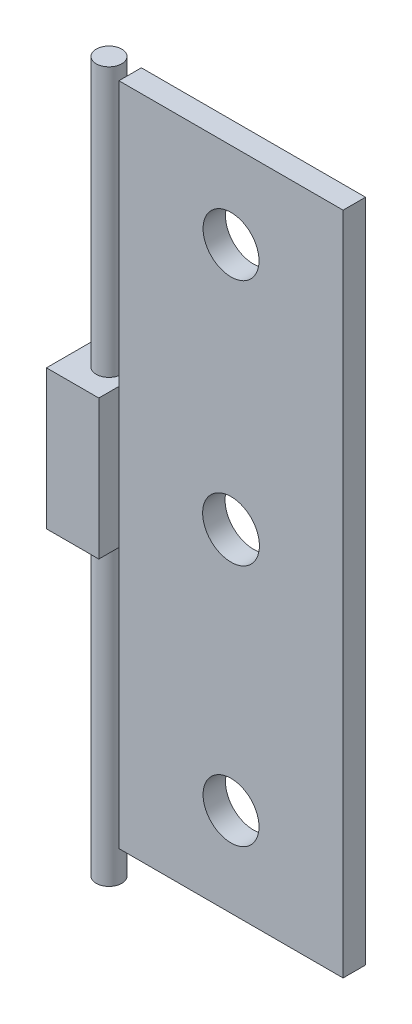
ISO-10303-21;
HEADER;
FILE_DESCRIPTION(('STEP AP214'),'2;1');
FILE_NAME('part.step','',(''),(''),'','','');
FILE_SCHEMA(('AUTOMOTIVE_DESIGN { 1 0 10303 214 1 1 1 1 }'));
ENDSEC;
DATA;
#1=APPLICATION_CONTEXT('core data for automotive mechanical design processes');
#2=APPLICATION_PROTOCOL_DEFINITION('international standard','automotive_design',2000,#1);
#3=PRODUCT_CONTEXT('',#1,'mechanical');
#4=PRODUCT('Part','Part','',(#3));
#5=PRODUCT_RELATED_PRODUCT_CATEGORY('part','',(#4));
#6=PRODUCT_DEFINITION_FORMATION('','',#4);
#7=PRODUCT_DEFINITION_CONTEXT('part definition',#1,'design');
#8=PRODUCT_DEFINITION('design','',#6,#7);
#9=PRODUCT_DEFINITION_SHAPE('','',#8);
#10=(LENGTH_UNIT() NAMED_UNIT(*) SI_UNIT(.MILLI.,.METRE.));
#11=(NAMED_UNIT(*) PLANE_ANGLE_UNIT() SI_UNIT($,.RADIAN.));
#12=(NAMED_UNIT(*) SI_UNIT($,.STERADIAN.) SOLID_ANGLE_UNIT());
#13=UNCERTAINTY_MEASURE_WITH_UNIT(LENGTH_MEASURE(1.E-05),#10,'distance_accuracy_value','');
#14=(GEOMETRIC_REPRESENTATION_CONTEXT(3) GLOBAL_UNCERTAINTY_ASSIGNED_CONTEXT((#13)) GLOBAL_UNIT_ASSIGNED_CONTEXT((#10,
#11,#12)) REPRESENTATION_CONTEXT('',''));
#15=CARTESIAN_POINT('',(0.,0.,0.));
#16=DIRECTION('',(0.,0.,1.));
#17=DIRECTION('',(1.,0.,0.));
#18=AXIS2_PLACEMENT_3D('',#15,#16,#17);
#19=CARTESIAN_POINT('',(-15.,44.5,3.));
#20=DIRECTION('',(1.,0.,0.));
#21=DIRECTION('',(0.,1.,0.));
#22=AXIS2_PLACEMENT_3D('',#19,#20,#21);
#23=PLANE('',#22);
#24=DIRECTION('',(0.,0.,1.));
#25=VECTOR('',#24,1.);
#26=CARTESIAN_POINT('',(-15.,-9.59284415623074,-1.52453052807984));
#27=LINE('',#26,#25);
#28=CARTESIAN_POINT('',(-15.,-9.59284415623074,0.));
#29=VERTEX_POINT('',#28);
#30=CARTESIAN_POINT('',(-15.,-9.59284415623074,3.));
#31=VERTEX_POINT('',#30);
#32=EDGE_CURVE('E11',#29,#31,#27,.T.);
#33=ORIENTED_EDGE('',*,*,#32,.F.);
#34=DIRECTION('',(0.,-1.,0.));
#35=VECTOR('',#34,1.);
#36=CARTESIAN_POINT('',(-15.,44.5,0.));
#37=LINE('',#36,#35);
#38=CARTESIAN_POINT('',(-15.,-44.5,0.));
#39=VERTEX_POINT('',#38);
#40=EDGE_CURVE('E178',#29,#39,#37,.T.);
#41=ORIENTED_EDGE('',*,*,#40,.T.);
#42=DIRECTION('',(0.,0.,-1.));
#43=VECTOR('',#42,1.);
#44=CARTESIAN_POINT('',(-15.,-44.5,3.));
#45=LINE('',#44,#43);
#46=CARTESIAN_POINT('',(-15.,-44.5,3.));
#47=VERTEX_POINT('',#46);
#48=EDGE_CURVE('E185',#47,#39,#45,.T.);
#49=ORIENTED_EDGE('',*,*,#48,.F.);
#50=DIRECTION('',(0.,-1.,0.));
#51=VECTOR('',#50,1.);
#52=CARTESIAN_POINT('',(-15.,44.5,3.));
#53=LINE('',#52,#51);
#54=EDGE_CURVE('E51',#31,#47,#53,.T.);
#55=ORIENTED_EDGE('',*,*,#54,.F.);
#56=EDGE_LOOP('',(#33,#41,#49,#55));
#57=FACE_BOUND('',#56,.T.);
#58=ADVANCED_FACE('F32',(#57),#23,.F.);
#59=DIRECTION('',(0.,0.,-1.));
#60=VECTOR('',#59,1.);
#61=CARTESIAN_POINT('',(-15.,9.07482542113769,-1.52453052807984));
#62=LINE('',#61,#60);
#63=CARTESIAN_POINT('',(-15.,9.07482542113769,3.));
#64=VERTEX_POINT('',#63);
#65=CARTESIAN_POINT('',(-15.,9.07482542113769,0.));
#66=VERTEX_POINT('',#65);
#67=EDGE_CURVE('E41',#64,#66,#62,.T.);
#68=ORIENTED_EDGE('',*,*,#67,.F.);
#69=CARTESIAN_POINT('',(-15.,44.5,3.));
#70=VERTEX_POINT('',#69);
#71=EDGE_CURVE('E168',#70,#64,#53,.T.);
#72=ORIENTED_EDGE('',*,*,#71,.F.);
#73=DIRECTION('',(0.,0.,-1.));
#74=VECTOR('',#73,1.);
#75=CARTESIAN_POINT('',(-15.,44.5,3.));
#76=LINE('',#75,#74);
#77=CARTESIAN_POINT('',(-15.,44.5,0.));
#78=VERTEX_POINT('',#77);
#79=EDGE_CURVE('E188',#70,#78,#76,.T.);
#80=ORIENTED_EDGE('',*,*,#79,.T.);
#81=EDGE_CURVE('E179',#78,#66,#37,.T.);
#82=ORIENTED_EDGE('',*,*,#81,.T.);
#83=EDGE_LOOP('',(#68,#72,#80,#82));
#84=FACE_BOUND('',#83,.T.);
#85=ADVANCED_FACE('F237',(#84),#23,.F.);
#86=CARTESIAN_POINT('',(15.,44.5,3.));
#87=DIRECTION('',(-1.,0.,0.));
#88=DIRECTION('',(0.,-1.,0.));
#89=AXIS2_PLACEMENT_3D('',#86,#87,#88);
#90=PLANE('',#89);
#91=DIRECTION('',(0.,1.,0.));
#92=VECTOR('',#91,1.);
#93=CARTESIAN_POINT('',(15.,44.5,0.));
#94=LINE('',#93,#92);
#95=CARTESIAN_POINT('',(15.,-44.5,0.));
#96=VERTEX_POINT('',#95);
#97=CARTESIAN_POINT('',(15.,44.5,0.));
#98=VERTEX_POINT('',#97);
#99=EDGE_CURVE('E159',#96,#98,#94,.T.);
#100=ORIENTED_EDGE('',*,*,#99,.T.);
#101=DIRECTION('',(0.,0.,-1.));
#102=VECTOR('',#101,1.);
#103=CARTESIAN_POINT('',(15.,44.5,3.));
#104=LINE('',#103,#102);
#105=CARTESIAN_POINT('',(15.,44.5,3.));
#106=VERTEX_POINT('',#105);
#107=EDGE_CURVE('E190',#106,#98,#104,.T.);
#108=ORIENTED_EDGE('',*,*,#107,.F.);
#109=DIRECTION('',(0.,1.,0.));
#110=VECTOR('',#109,1.);
#111=CARTESIAN_POINT('',(15.,44.5,3.));
#112=LINE('',#111,#110);
#113=CARTESIAN_POINT('',(15.,-44.5,3.));
#114=VERTEX_POINT('',#113);
#115=EDGE_CURVE('E162',#114,#106,#112,.T.);
#116=ORIENTED_EDGE('',*,*,#115,.F.);
#117=DIRECTION('',(0.,0.,-1.));
#118=VECTOR('',#117,1.);
#119=CARTESIAN_POINT('',(15.,-44.5,3.));
#120=LINE('',#119,#118);
#121=EDGE_CURVE('E173',#114,#96,#120,.T.);
#122=ORIENTED_EDGE('',*,*,#121,.T.);
#123=EDGE_LOOP('',(#100,#108,#116,#122));
#124=FACE_BOUND('',#123,.T.);
#125=ADVANCED_FACE('F34',(#124),#90,.F.);
#126=CARTESIAN_POINT('',(-15.,44.5,3.));
#127=DIRECTION('',(0.,-1.,0.));
#128=DIRECTION('',(0.,0.,-1.));
#129=AXIS2_PLACEMENT_3D('',#126,#127,#128);
#130=PLANE('',#129);
#131=DIRECTION('',(-1.,0.,0.));
#132=VECTOR('',#131,1.);
#133=CARTESIAN_POINT('',(-15.,44.5,0.));
#134=LINE('',#133,#132);
#135=EDGE_CURVE('E176',#98,#78,#134,.T.);
#136=ORIENTED_EDGE('',*,*,#135,.T.);
#137=ORIENTED_EDGE('',*,*,#79,.F.);
#138=DIRECTION('',(-1.,0.,0.));
#139=VECTOR('',#138,1.);
#140=CARTESIAN_POINT('',(-15.,44.5,3.));
#141=LINE('',#140,#139);
#142=EDGE_CURVE('E165',#106,#70,#141,.T.);
#143=ORIENTED_EDGE('',*,*,#142,.F.);
#144=ORIENTED_EDGE('',*,*,#107,.T.);
#145=EDGE_LOOP('',(#136,#137,#143,#144));
#146=FACE_BOUND('',#145,.T.);
#147=ADVANCED_FACE('F245',(#146),#130,.F.);
#148=CARTESIAN_POINT('',(-15.,-44.5,3.));
#149=DIRECTION('',(0.,1.,0.));
#150=DIRECTION('',(0.,0.,1.));
#151=AXIS2_PLACEMENT_3D('',#148,#149,#150);
#152=PLANE('',#151);
#153=DIRECTION('',(1.,0.,0.));
#154=VECTOR('',#153,1.);
#155=CARTESIAN_POINT('',(-15.,-44.5,0.));
#156=LINE('',#155,#154);
#157=EDGE_CURVE('E166',#39,#96,#156,.T.);
#158=ORIENTED_EDGE('',*,*,#157,.T.);
#159=ORIENTED_EDGE('',*,*,#121,.F.);
#160=DIRECTION('',(1.,0.,0.));
#161=VECTOR('',#160,1.);
#162=CARTESIAN_POINT('',(-15.,-44.5,3.));
#163=LINE('',#162,#161);
#164=EDGE_CURVE('E170',#47,#114,#163,.T.);
#165=ORIENTED_EDGE('',*,*,#164,.F.);
#166=ORIENTED_EDGE('',*,*,#48,.T.);
#167=EDGE_LOOP('',(#158,#159,#165,#166));
#168=FACE_BOUND('',#167,.T.);
#169=ADVANCED_FACE('F243',(#168),#152,.F.);
#170=CARTESIAN_POINT('',(0.,0.,3.));
#171=DIRECTION('',(0.,0.,1.));
#172=DIRECTION('',(1.,0.,0.));
#173=AXIS2_PLACEMENT_3D('',#170,#171,#172);
#174=PLANE('',#173);
#175=CARTESIAN_POINT('',(0.,32.9972863131631,3.));
#176=DIRECTION('',(0.,0.,1.));
#177=DIRECTION('',(1.,0.,0.));
#178=AXIS2_PLACEMENT_3D('',#175,#176,#177);
#179=CIRCLE('',#178,3.74297576089611);
#180=CARTESIAN_POINT('',(3.74297576089611,32.9972863131631,3.));
#181=VERTEX_POINT('',#180);
#182=EDGE_CURVE('E151',#181,#181,#179,.T.);
#183=ORIENTED_EDGE('',*,*,#182,.F.);
#184=EDGE_LOOP('',(#183));
#185=FACE_BOUND('',#184,.T.);
#186=CARTESIAN_POINT('',(0.,-32.6032888646477,3.));
#187=DIRECTION('',(0.,0.,1.));
#188=DIRECTION('',(1.,0.,0.));
#189=AXIS2_PLACEMENT_3D('',#186,#187,#188);
#190=CIRCLE('',#189,3.74297576089611);
#191=CARTESIAN_POINT('',(3.74297576089611,-32.6032888646477,3.));
#192=VERTEX_POINT('',#191);
#193=EDGE_CURVE('E138',#192,#192,#190,.T.);
#194=ORIENTED_EDGE('',*,*,#193,.F.);
#195=EDGE_LOOP('',(#194));
#196=FACE_BOUND('',#195,.T.);
#197=CARTESIAN_POINT('',(0.,0.,3.));
#198=DIRECTION('',(0.,0.,1.));
#199=DIRECTION('',(1.,0.,0.));
#200=AXIS2_PLACEMENT_3D('',#197,#198,#199);
#201=CIRCLE('',#200,3.80085031827698);
#202=CARTESIAN_POINT('',(3.80085031827698,0.,3.));
#203=VERTEX_POINT('',#202);
#204=EDGE_CURVE('E150',#203,#203,#201,.T.);
#205=ORIENTED_EDGE('',*,*,#204,.F.);
#206=EDGE_LOOP('',(#205));
#207=FACE_BOUND('',#206,.T.);
#208=ORIENTED_EDGE('',*,*,#115,.T.);
#209=ORIENTED_EDGE('',*,*,#142,.T.);
#210=ORIENTED_EDGE('',*,*,#71,.T.);
#211=EDGE_CURVE('E171',#64,#31,#53,.T.);
#212=ORIENTED_EDGE('',*,*,#211,.T.);
#213=ORIENTED_EDGE('',*,*,#54,.T.);
#214=ORIENTED_EDGE('',*,*,#164,.T.);
#215=EDGE_LOOP('',(#208,#209,#210,#212,#213,#214));
#216=FACE_BOUND('',#215,.T.);
#217=ADVANCED_FACE('F251',(#185,#196,#207,#216),#174,.T.);
#218=CARTESIAN_POINT('',(0.,0.,0.));
#219=DIRECTION('',(0.,0.,1.));
#220=DIRECTION('',(1.,0.,0.));
#221=AXIS2_PLACEMENT_3D('',#218,#219,#220);
#222=PLANE('',#221);
#223=CARTESIAN_POINT('',(0.,32.9972863131631,0.));
#224=DIRECTION('',(0.,0.,1.));
#225=DIRECTION('',(1.,0.,0.));
#226=AXIS2_PLACEMENT_3D('',#223,#224,#225);
#227=CIRCLE('',#226,3.74297576089611);
#228=CARTESIAN_POINT('',(3.74297576089611,32.9972863131631,0.));
#229=VERTEX_POINT('',#228);
#230=EDGE_CURVE('E147',#229,#229,#227,.T.);
#231=ORIENTED_EDGE('',*,*,#230,.T.);
#232=EDGE_LOOP('',(#231));
#233=FACE_BOUND('',#232,.T.);
#234=CARTESIAN_POINT('',(0.,-32.6032888646477,0.));
#235=DIRECTION('',(0.,0.,1.));
#236=DIRECTION('',(1.,0.,0.));
#237=AXIS2_PLACEMENT_3D('',#234,#235,#236);
#238=CIRCLE('',#237,3.74297576089611);
#239=CARTESIAN_POINT('',(3.74297576089611,-32.6032888646477,0.));
#240=VERTEX_POINT('',#239);
#241=EDGE_CURVE('E141',#240,#240,#238,.T.);
#242=ORIENTED_EDGE('',*,*,#241,.T.);
#243=EDGE_LOOP('',(#242));
#244=FACE_BOUND('',#243,.T.);
#245=CARTESIAN_POINT('',(0.,0.,0.));
#246=DIRECTION('',(0.,0.,1.));
#247=DIRECTION('',(1.,0.,0.));
#248=AXIS2_PLACEMENT_3D('',#245,#246,#247);
#249=CIRCLE('',#248,3.80085031827698);
#250=CARTESIAN_POINT('',(3.80085031827698,0.,0.));
#251=VERTEX_POINT('',#250);
#252=EDGE_CURVE('E156',#251,#251,#249,.T.);
#253=ORIENTED_EDGE('',*,*,#252,.T.);
#254=EDGE_LOOP('',(#253));
#255=FACE_BOUND('',#254,.T.);
#256=ORIENTED_EDGE('',*,*,#99,.F.);
#257=ORIENTED_EDGE('',*,*,#157,.F.);
#258=ORIENTED_EDGE('',*,*,#40,.F.);
#259=EDGE_CURVE('E181',#66,#29,#37,.T.);
#260=ORIENTED_EDGE('',*,*,#259,.F.);
#261=ORIENTED_EDGE('',*,*,#81,.F.);
#262=ORIENTED_EDGE('',*,*,#135,.F.);
#263=EDGE_LOOP('',(#256,#257,#258,#260,#261,#262));
#264=FACE_BOUND('',#263,.T.);
#265=ADVANCED_FACE('F259',(#233,#244,#255,#264),#222,.F.);
#266=CARTESIAN_POINT('',(0.,0.,0.));
#267=DIRECTION('',(0.,0.,1.));
#268=DIRECTION('',(1.,0.,0.));
#269=AXIS2_PLACEMENT_3D('',#266,#267,#268);
#270=CYLINDRICAL_SURFACE('',#269,3.80085031827698);
#271=ORIENTED_EDGE('',*,*,#252,.F.);
#272=EDGE_LOOP('',(#271));
#273=FACE_BOUND('',#272,.T.);
#274=ORIENTED_EDGE('',*,*,#204,.T.);
#275=EDGE_LOOP('',(#274));
#276=FACE_BOUND('',#275,.T.);
#277=ADVANCED_FACE('F285',(#273,#276),#270,.F.);
#278=CARTESIAN_POINT('',(0.,-32.6032888646477,0.));
#279=DIRECTION('',(0.,0.,1.));
#280=DIRECTION('',(1.,0.,0.));
#281=AXIS2_PLACEMENT_3D('',#278,#279,#280);
#282=CYLINDRICAL_SURFACE('',#281,3.74297576089611);
#283=ORIENTED_EDGE('',*,*,#241,.F.);
#284=EDGE_LOOP('',(#283));
#285=FACE_BOUND('',#284,.T.);
#286=ORIENTED_EDGE('',*,*,#193,.T.);
#287=EDGE_LOOP('',(#286));
#288=FACE_BOUND('',#287,.T.);
#289=ADVANCED_FACE('F292',(#285,#288),#282,.F.);
#290=CARTESIAN_POINT('',(0.,32.9972863131631,0.));
#291=DIRECTION('',(0.,0.,1.));
#292=DIRECTION('',(1.,0.,0.));
#293=AXIS2_PLACEMENT_3D('',#290,#291,#292);
#294=CYLINDRICAL_SURFACE('',#293,3.74297576089611);
#295=ORIENTED_EDGE('',*,*,#230,.F.);
#296=EDGE_LOOP('',(#295));
#297=FACE_BOUND('',#296,.T.);
#298=ORIENTED_EDGE('',*,*,#182,.T.);
#299=EDGE_LOOP('',(#298));
#300=FACE_BOUND('',#299,.T.);
#301=ADVANCED_FACE('F296',(#297,#300),#294,.F.);
#302=CARTESIAN_POINT('',(-15.,0.,0.));
#303=DIRECTION('',(-1.,0.,0.));
#304=DIRECTION('',(0.,-1.,0.));
#305=AXIS2_PLACEMENT_3D('',#302,#303,#304);
#306=PLANE('',#305);
#307=CARTESIAN_POINT('',(-15.,9.07482542113769,-1.52453052807984));
#308=VERTEX_POINT('',#307);
#309=EDGE_CURVE('E196',#66,#308,#62,.T.);
#310=ORIENTED_EDGE('',*,*,#309,.F.);
#311=ORIENTED_EDGE('',*,*,#259,.T.);
#312=CARTESIAN_POINT('',(-15.,-9.59284415623074,-1.52453052807984));
#313=VERTEX_POINT('',#312);
#314=EDGE_CURVE('E43',#313,#29,#27,.T.);
#315=ORIENTED_EDGE('',*,*,#314,.F.);
#316=DIRECTION('',(0.,-1.,0.));
#317=VECTOR('',#316,1.);
#318=CARTESIAN_POINT('',(-15.,9.07482542113769,-1.52453052807984));
#319=LINE('',#318,#317);
#320=EDGE_CURVE('E199',#308,#313,#319,.T.);
#321=ORIENTED_EDGE('',*,*,#320,.F.);
#322=EDGE_LOOP('',(#310,#311,#315,#321));
#323=FACE_BOUND('',#322,.T.);
#324=ADVANCED_FACE('F234',(#323),#306,.F.);
#325=CARTESIAN_POINT('',(-22.,9.07482542113769,5.69897968749444));
#326=DIRECTION('',(0.,0.,-1.));
#327=DIRECTION('',(0.,1.,0.));
#328=AXIS2_PLACEMENT_3D('',#325,#326,#327);
#329=PLANE('',#328);
#330=DIRECTION('',(0.,1.,0.));
#331=VECTOR('',#330,1.);
#332=CARTESIAN_POINT('',(-15.,9.07482542113769,5.69897968749444));
#333=LINE('',#332,#331);
#334=CARTESIAN_POINT('',(-15.,-9.59284415623074,5.69897968749444));
#335=VERTEX_POINT('',#334);
#336=CARTESIAN_POINT('',(-15.,9.07482542113769,5.69897968749444));
#337=VERTEX_POINT('',#336);
#338=EDGE_CURVE('E137',#335,#337,#333,.T.);
#339=ORIENTED_EDGE('',*,*,#338,.T.);
#340=DIRECTION('',(1.,0.,0.));
#341=VECTOR('',#340,1.);
#342=CARTESIAN_POINT('',(-22.,9.07482542113769,5.69897968749444));
#343=LINE('',#342,#341);
#344=CARTESIAN_POINT('',(-22.,9.07482542113769,5.69897968749444));
#345=VERTEX_POINT('',#344);
#346=EDGE_CURVE('E118',#345,#337,#343,.T.);
#347=ORIENTED_EDGE('',*,*,#346,.F.);
#348=DIRECTION('',(0.,1.,0.));
#349=VECTOR('',#348,1.);
#350=CARTESIAN_POINT('',(-22.,9.07482542113769,5.69897968749444));
#351=LINE('',#350,#349);
#352=CARTESIAN_POINT('',(-22.,-9.59284415623074,5.69897968749444));
#353=VERTEX_POINT('',#352);
#354=EDGE_CURVE('E125',#353,#345,#351,.T.);
#355=ORIENTED_EDGE('',*,*,#354,.F.);
#356=DIRECTION('',(1.,0.,0.));
#357=VECTOR('',#356,1.);
#358=CARTESIAN_POINT('',(-22.,-9.59284415623074,5.69897968749444));
#359=LINE('',#358,#357);
#360=EDGE_CURVE('E206',#353,#335,#359,.T.);
#361=ORIENTED_EDGE('',*,*,#360,.T.);
#362=EDGE_LOOP('',(#339,#347,#355,#361));
#363=FACE_BOUND('',#362,.T.);
#364=ADVANCED_FACE('F135',(#363),#329,.F.);
#365=CARTESIAN_POINT('',(-22.,9.07482542113769,-1.52453052807984));
#366=DIRECTION('',(0.,-1.,0.));
#367=DIRECTION('',(1.,0.,0.));
#368=AXIS2_PLACEMENT_3D('',#365,#366,#367);
#369=PLANE('',#368);
#370=CARTESIAN_POINT('',(-17.9104781420044,9.07482542113769,1.42207933798248));
#371=DIRECTION('',(0.,-1.,0.));
#372=DIRECTION('',(1.,0.,0.));
#373=AXIS2_PLACEMENT_3D('',#370,#371,#372);
#374=CIRCLE('',#373,1.7075213994092);
#375=CARTESIAN_POINT('',(-16.2029567425952,9.07482542113769,1.42207933798248));
#376=VERTEX_POINT('',#375);
#377=EDGE_CURVE('E201',#376,#376,#374,.T.);
#378=ORIENTED_EDGE('',*,*,#377,.T.);
#379=EDGE_LOOP('',(#378));
#380=FACE_BOUND('',#379,.T.);
#381=EDGE_CURVE('E195',#337,#64,#62,.T.);
#382=ORIENTED_EDGE('',*,*,#381,.T.);
#383=ORIENTED_EDGE('',*,*,#67,.T.);
#384=ORIENTED_EDGE('',*,*,#309,.T.);
#385=DIRECTION('',(1.,0.,0.));
#386=VECTOR('',#385,1.);
#387=CARTESIAN_POINT('',(-22.,9.07482542113769,-1.52453052807984));
#388=LINE('',#387,#386);
#389=CARTESIAN_POINT('',(-22.,9.07482542113769,-1.52453052807984));
#390=VERTEX_POINT('',#389);
#391=EDGE_CURVE('E121',#390,#308,#388,.T.);
#392=ORIENTED_EDGE('',*,*,#391,.F.);
#393=DIRECTION('',(0.,0.,-1.));
#394=VECTOR('',#393,1.);
#395=CARTESIAN_POINT('',(-22.,9.07482542113769,-1.52453052807984));
#396=LINE('',#395,#394);
#397=EDGE_CURVE('E113',#345,#390,#396,.T.);
#398=ORIENTED_EDGE('',*,*,#397,.F.);
#399=ORIENTED_EDGE('',*,*,#346,.T.);
#400=EDGE_LOOP('',(#382,#383,#384,#392,#398,#399));
#401=FACE_BOUND('',#400,.T.);
#402=ADVANCED_FACE('F116',(#380,#401),#369,.F.);
#403=CARTESIAN_POINT('',(-22.,9.07482542113769,-1.52453052807984));
#404=DIRECTION('',(0.,0.,1.));
#405=DIRECTION('',(1.,0.,0.));
#406=AXIS2_PLACEMENT_3D('',#403,#404,#405);
#407=PLANE('',#406);
#408=ORIENTED_EDGE('',*,*,#320,.T.);
#409=DIRECTION('',(1.,0.,0.));
#410=VECTOR('',#409,1.);
#411=CARTESIAN_POINT('',(-22.,-9.59284415623074,-1.52453052807984));
#412=LINE('',#411,#410);
#413=CARTESIAN_POINT('',(-22.,-9.59284415623074,-1.52453052807984));
#414=VERTEX_POINT('',#413);
#415=EDGE_CURVE('E143',#414,#313,#412,.T.);
#416=ORIENTED_EDGE('',*,*,#415,.F.);
#417=DIRECTION('',(0.,-1.,0.));
#418=VECTOR('',#417,1.);
#419=CARTESIAN_POINT('',(-22.,9.07482542113769,-1.52453052807984));
#420=LINE('',#419,#418);
#421=EDGE_CURVE('E124',#390,#414,#420,.T.);
#422=ORIENTED_EDGE('',*,*,#421,.F.);
#423=ORIENTED_EDGE('',*,*,#391,.T.);
#424=EDGE_LOOP('',(#408,#416,#422,#423));
#425=FACE_BOUND('',#424,.T.);
#426=ADVANCED_FACE('F225',(#425),#407,.F.);
#427=CARTESIAN_POINT('',(-22.,-9.59284415623074,-1.52453052807984));
#428=DIRECTION('',(0.,1.,0.));
#429=DIRECTION('',(-1.,0.,0.));
#430=AXIS2_PLACEMENT_3D('',#427,#428,#429);
#431=PLANE('',#430);
#432=CARTESIAN_POINT('',(-17.9104781420044,-9.59284415623074,1.42207933798248));
#433=DIRECTION('',(0.,1.,0.));
#434=DIRECTION('',(-1.,0.,0.));
#435=AXIS2_PLACEMENT_3D('',#432,#433,#434);
#436=CIRCLE('',#435,1.7075213994092);
#437=CARTESIAN_POINT('',(-19.6179995414136,-9.59284415623074,1.42207933798248));
#438=VERTEX_POINT('',#437);
#439=EDGE_CURVE('E36',#438,#438,#436,.T.);
#440=ORIENTED_EDGE('',*,*,#439,.T.);
#441=EDGE_LOOP('',(#440));
#442=FACE_BOUND('',#441,.T.);
#443=ORIENTED_EDGE('',*,*,#314,.T.);
#444=ORIENTED_EDGE('',*,*,#32,.T.);
#445=EDGE_CURVE('E44',#31,#335,#27,.T.);
#446=ORIENTED_EDGE('',*,*,#445,.T.);
#447=ORIENTED_EDGE('',*,*,#360,.F.);
#448=DIRECTION('',(0.,0.,1.));
#449=VECTOR('',#448,1.);
#450=CARTESIAN_POINT('',(-22.,-9.59284415623074,-1.52453052807984));
#451=LINE('',#450,#449);
#452=EDGE_CURVE('E130',#414,#353,#451,.T.);
#453=ORIENTED_EDGE('',*,*,#452,.F.);
#454=ORIENTED_EDGE('',*,*,#415,.T.);
#455=EDGE_LOOP('',(#443,#444,#446,#447,#453,#454));
#456=FACE_BOUND('',#455,.T.);
#457=ADVANCED_FACE('F231',(#442,#456),#431,.F.);
#458=CARTESIAN_POINT('',(-22.,0.,0.));
#459=DIRECTION('',(-1.,0.,0.));
#460=DIRECTION('',(0.,-1.,0.));
#461=AXIS2_PLACEMENT_3D('',#458,#459,#460);
#462=PLANE('',#461);
#463=ORIENTED_EDGE('',*,*,#354,.T.);
#464=ORIENTED_EDGE('',*,*,#397,.T.);
#465=ORIENTED_EDGE('',*,*,#421,.T.);
#466=ORIENTED_EDGE('',*,*,#452,.T.);
#467=EDGE_LOOP('',(#463,#464,#465,#466));
#468=FACE_BOUND('',#467,.T.);
#469=ADVANCED_FACE('F128',(#468),#462,.T.);
#470=ORIENTED_EDGE('',*,*,#211,.F.);
#471=ORIENTED_EDGE('',*,*,#381,.F.);
#472=ORIENTED_EDGE('',*,*,#338,.F.);
#473=ORIENTED_EDGE('',*,*,#445,.F.);
#474=EDGE_LOOP('',(#470,#471,#472,#473));
#475=FACE_BOUND('',#474,.T.);
#476=ADVANCED_FACE('F274',(#475),#306,.F.);
#477=CARTESIAN_POINT('',(-17.9104781420044,-49.9251745788623,1.42207933798248));
#478=DIRECTION('',(0.,1.,0.));
#479=DIRECTION('',(-1.,0.,0.));
#480=AXIS2_PLACEMENT_3D('',#477,#478,#479);
#481=PLANE('',#480);
#482=CARTESIAN_POINT('',(-17.9104781420044,-49.9251745788623,1.42207933798248));
#483=DIRECTION('',(0.,1.,0.));
#484=DIRECTION('',(-1.,0.,0.));
#485=AXIS2_PLACEMENT_3D('',#482,#483,#484);
#486=CIRCLE('',#485,1.7075213994092);
#487=CARTESIAN_POINT('',(-19.6179995414136,-49.9251745788623,1.42207933798248));
#488=VERTEX_POINT('',#487);
#489=EDGE_CURVE('E208',#488,#488,#486,.T.);
#490=ORIENTED_EDGE('',*,*,#489,.F.);
#491=EDGE_LOOP('',(#490));
#492=FACE_BOUND('',#491,.T.);
#493=ADVANCED_FACE('F320',(#492),#481,.F.);
#494=CARTESIAN_POINT('',(-17.9104781420044,-49.9251745788623,1.42207933798248));
#495=DIRECTION('',(0.,1.,0.));
#496=DIRECTION('',(-1.,0.,0.));
#497=AXIS2_PLACEMENT_3D('',#494,#495,#496);
#498=CYLINDRICAL_SURFACE('',#497,1.7075213994092);
#499=ORIENTED_EDGE('',*,*,#489,.T.);
#500=EDGE_LOOP('',(#499));
#501=FACE_BOUND('',#500,.T.);
#502=ORIENTED_EDGE('',*,*,#439,.F.);
#503=EDGE_LOOP('',(#502));
#504=FACE_BOUND('',#503,.T.);
#505=ADVANCED_FACE('F220',(#501,#504),#498,.T.);
#506=CARTESIAN_POINT('',(-17.9104781420044,45.0748254211377,1.42207933798248));
#507=DIRECTION('',(0.,1.,0.));
#508=DIRECTION('',(-1.,0.,0.));
#509=AXIS2_PLACEMENT_3D('',#506,#507,#508);
#510=CIRCLE('',#509,1.7075213994092);
#511=CARTESIAN_POINT('',(-19.6179995414136,45.0748254211377,1.42207933798248));
#512=VERTEX_POINT('',#511);
#513=EDGE_CURVE('E211',#512,#512,#510,.T.);
#514=ORIENTED_EDGE('',*,*,#513,.F.);
#515=EDGE_LOOP('',(#514));
#516=FACE_BOUND('',#515,.T.);
#517=ORIENTED_EDGE('',*,*,#377,.F.);
#518=EDGE_LOOP('',(#517));
#519=FACE_BOUND('',#518,.T.);
#520=ADVANCED_FACE('F217',(#516,#519),#498,.T.);
#521=CARTESIAN_POINT('',(-17.9104781420044,45.0748254211377,1.42207933798248));
#522=DIRECTION('',(0.,1.,0.));
#523=DIRECTION('',(-1.,0.,0.));
#524=AXIS2_PLACEMENT_3D('',#521,#522,#523);
#525=PLANE('',#524);
#526=ORIENTED_EDGE('',*,*,#513,.T.);
#527=EDGE_LOOP('',(#526));
#528=FACE_BOUND('',#527,.T.);
#529=ADVANCED_FACE('F215',(#528),#525,.T.);
#530=CLOSED_SHELL('',(#58,#85,#125,#147,#169,#217,#265,#277,#289,#301,#324,#364,#402,#426,#457,
#469,#476,#493,#505,#520,#529));
#531=MANIFOLD_SOLID_BREP('B2',#530);
#532=ADVANCED_BREP_SHAPE_REPRESENTATION('',(#18,#531),#14);
#533=SHAPE_DEFINITION_REPRESENTATION(#9,#532);
ENDSEC;
END-ISO-10303-21;
